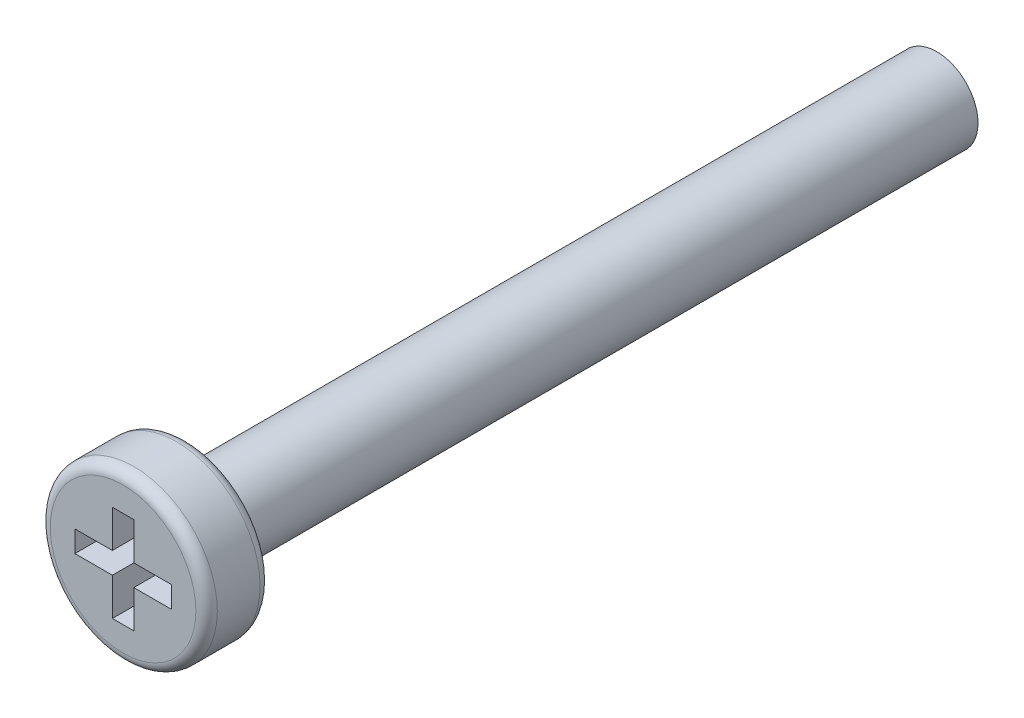
ISO-10303-21;
HEADER;
FILE_DESCRIPTION(('STEP AP214'),'2;1');
FILE_NAME('part.step','',(''),(''),'','','');
FILE_SCHEMA(('AUTOMOTIVE_DESIGN { 1 0 10303 214 1 1 1 1 }'));
ENDSEC;
DATA;
#1=APPLICATION_CONTEXT('core data for automotive mechanical design processes');
#2=APPLICATION_PROTOCOL_DEFINITION('international standard','automotive_design',2000,#1);
#3=PRODUCT_CONTEXT('',#1,'mechanical');
#4=PRODUCT('Part','Part','',(#3));
#5=PRODUCT_RELATED_PRODUCT_CATEGORY('part','',(#4));
#6=PRODUCT_DEFINITION_FORMATION('','',#4);
#7=PRODUCT_DEFINITION_CONTEXT('part definition',#1,'design');
#8=PRODUCT_DEFINITION('design','',#6,#7);
#9=PRODUCT_DEFINITION_SHAPE('','',#8);
#10=(LENGTH_UNIT() NAMED_UNIT(*) SI_UNIT(.MILLI.,.METRE.));
#11=(NAMED_UNIT(*) PLANE_ANGLE_UNIT() SI_UNIT($,.RADIAN.));
#12=(NAMED_UNIT(*) SI_UNIT($,.STERADIAN.) SOLID_ANGLE_UNIT());
#13=UNCERTAINTY_MEASURE_WITH_UNIT(LENGTH_MEASURE(1.E-05),#10,'distance_accuracy_value','');
#14=(GEOMETRIC_REPRESENTATION_CONTEXT(3) GLOBAL_UNCERTAINTY_ASSIGNED_CONTEXT((#13)) GLOBAL_UNIT_ASSIGNED_CONTEXT((#10,
#11,#12)) REPRESENTATION_CONTEXT('',''));
#15=CARTESIAN_POINT('',(0.,0.,0.));
#16=DIRECTION('',(0.,0.,1.));
#17=DIRECTION('',(1.,0.,0.));
#18=AXIS2_PLACEMENT_3D('',#15,#16,#17);
#19=CARTESIAN_POINT('',(0.,0.,0.));
#20=DIRECTION('',(0.,0.,1.));
#21=DIRECTION('',(1.,0.,0.));
#22=AXIS2_PLACEMENT_3D('',#19,#20,#21);
#23=PLANE('',#22);
#24=CARTESIAN_POINT('',(0.,0.,0.));
#25=DIRECTION('',(0.,0.,1.));
#26=DIRECTION('',(1.,0.,0.));
#27=AXIS2_PLACEMENT_3D('',#24,#25,#26);
#28=CIRCLE('',#27,3.4);
#29=CARTESIAN_POINT('',(3.4,0.,0.));
#30=VERTEX_POINT('',#29);
#31=EDGE_CURVE('E217',#30,#30,#28,.F.);
#32=ORIENTED_EDGE('',*,*,#31,.T.);
#33=EDGE_LOOP('',(#32));
#34=FACE_BOUND('',#33,.T.);
#35=CARTESIAN_POINT('',(0.,0.,0.));
#36=DIRECTION('',(0.,0.,1.));
#37=DIRECTION('',(1.,0.,0.));
#38=AXIS2_PLACEMENT_3D('',#35,#36,#37);
#39=CIRCLE('',#38,1.925);
#40=CARTESIAN_POINT('',(1.925,0.,0.));
#41=VERTEX_POINT('',#40);
#42=EDGE_CURVE('E11',#41,#41,#39,.F.);
#43=ORIENTED_EDGE('',*,*,#42,.F.);
#44=EDGE_LOOP('',(#43));
#45=FACE_BOUND('',#44,.T.);
#46=ADVANCED_FACE('F37',(#34,#45),#23,.F.);
#47=CARTESIAN_POINT('',(0.,0.,3.));
#48=DIRECTION('',(0.,0.,-1.));
#49=DIRECTION('',(-1.,0.,0.));
#50=AXIS2_PLACEMENT_3D('',#47,#48,#49);
#51=CYLINDRICAL_SURFACE('',#50,3.9);
#52=CARTESIAN_POINT('',(0.,0.,0.5));
#53=DIRECTION('',(0.,0.,1.));
#54=DIRECTION('',(1.,0.,0.));
#55=AXIS2_PLACEMENT_3D('',#52,#53,#54);
#56=CIRCLE('',#55,3.9);
#57=CARTESIAN_POINT('',(3.9,0.,0.5));
#58=VERTEX_POINT('',#57);
#59=EDGE_CURVE('E214',#58,#58,#56,.T.);
#60=ORIENTED_EDGE('',*,*,#59,.T.);
#61=EDGE_LOOP('',(#60));
#62=FACE_BOUND('',#61,.T.);
#63=CARTESIAN_POINT('',(0.,0.,2.5));
#64=DIRECTION('',(0.,0.,1.));
#65=DIRECTION('',(1.,0.,0.));
#66=AXIS2_PLACEMENT_3D('',#63,#64,#65);
#67=CIRCLE('',#66,3.9);
#68=CARTESIAN_POINT('',(3.9,0.,2.5));
#69=VERTEX_POINT('',#68);
#70=EDGE_CURVE('E194',#69,#69,#67,.F.);
#71=ORIENTED_EDGE('',*,*,#70,.T.);
#72=EDGE_LOOP('',(#71));
#73=FACE_BOUND('',#72,.T.);
#74=ADVANCED_FACE('F239',(#62,#73),#51,.T.);
#75=CARTESIAN_POINT('',(0.,0.,3.));
#76=DIRECTION('',(0.,0.,1.));
#77=DIRECTION('',(1.,0.,0.));
#78=AXIS2_PLACEMENT_3D('',#75,#76,#77);
#79=PLANE('',#78);
#80=CARTESIAN_POINT('',(0.,0.,3.));
#81=DIRECTION('',(0.,0.,1.));
#82=DIRECTION('',(1.,0.,0.));
#83=AXIS2_PLACEMENT_3D('',#80,#81,#82);
#84=CIRCLE('',#83,3.4);
#85=CARTESIAN_POINT('',(3.4,0.,3.));
#86=VERTEX_POINT('',#85);
#87=EDGE_CURVE('E45',#86,#86,#84,.T.);
#88=ORIENTED_EDGE('',*,*,#87,.T.);
#89=EDGE_LOOP('',(#88));
#90=FACE_BOUND('',#89,.T.);
#91=DIRECTION('',(0.,-1.,0.));
#92=VECTOR('',#91,1.);
#93=CARTESIAN_POINT('',(-0.5,-0.5,3.));
#94=LINE('',#93,#92);
#95=CARTESIAN_POINT('',(-0.5,-0.5,3.));
#96=VERTEX_POINT('',#95);
#97=CARTESIAN_POINT('',(-0.5,-2.25,3.));
#98=VERTEX_POINT('',#97);
#99=EDGE_CURVE('E52',#96,#98,#94,.T.);
#100=ORIENTED_EDGE('',*,*,#99,.F.);
#101=DIRECTION('',(1.,0.,0.));
#102=VECTOR('',#101,1.);
#103=CARTESIAN_POINT('',(-0.5,-0.5,3.));
#104=LINE('',#103,#102);
#105=CARTESIAN_POINT('',(-2.25,-0.5,3.));
#106=VERTEX_POINT('',#105);
#107=EDGE_CURVE('E190',#106,#96,#104,.T.);
#108=ORIENTED_EDGE('',*,*,#107,.F.);
#109=DIRECTION('',(0.,-1.,0.));
#110=VECTOR('',#109,1.);
#111=CARTESIAN_POINT('',(-2.25,0.5,3.));
#112=LINE('',#111,#110);
#113=CARTESIAN_POINT('',(-2.25,0.5,3.));
#114=VERTEX_POINT('',#113);
#115=EDGE_CURVE('E188',#114,#106,#112,.T.);
#116=ORIENTED_EDGE('',*,*,#115,.F.);
#117=DIRECTION('',(-1.,0.,0.));
#118=VECTOR('',#117,1.);
#119=CARTESIAN_POINT('',(-0.5,0.5,3.));
#120=LINE('',#119,#118);
#121=CARTESIAN_POINT('',(-0.5,0.5,3.));
#122=VERTEX_POINT('',#121);
#123=EDGE_CURVE('E136',#122,#114,#120,.T.);
#124=ORIENTED_EDGE('',*,*,#123,.F.);
#125=DIRECTION('',(0.,-1.,0.));
#126=VECTOR('',#125,1.);
#127=CARTESIAN_POINT('',(-0.5,2.25,3.));
#128=LINE('',#127,#126);
#129=CARTESIAN_POINT('',(-0.5,2.25,3.));
#130=VERTEX_POINT('',#129);
#131=EDGE_CURVE('E184',#130,#122,#128,.T.);
#132=ORIENTED_EDGE('',*,*,#131,.F.);
#133=DIRECTION('',(-1.,0.,0.));
#134=VECTOR('',#133,1.);
#135=CARTESIAN_POINT('',(0.5,2.25,3.));
#136=LINE('',#135,#134);
#137=CARTESIAN_POINT('',(0.5,2.25,3.));
#138=VERTEX_POINT('',#137);
#139=EDGE_CURVE('E181',#138,#130,#136,.T.);
#140=ORIENTED_EDGE('',*,*,#139,.F.);
#141=DIRECTION('',(0.,1.,0.));
#142=VECTOR('',#141,1.);
#143=CARTESIAN_POINT('',(0.5,2.25,3.));
#144=LINE('',#143,#142);
#145=CARTESIAN_POINT('',(0.5,0.5,3.));
#146=VERTEX_POINT('',#145);
#147=EDGE_CURVE('E178',#146,#138,#144,.T.);
#148=ORIENTED_EDGE('',*,*,#147,.F.);
#149=DIRECTION('',(-1.,0.,0.));
#150=VECTOR('',#149,1.);
#151=CARTESIAN_POINT('',(2.25,0.5,3.));
#152=LINE('',#151,#150);
#153=CARTESIAN_POINT('',(2.25,0.5,3.));
#154=VERTEX_POINT('',#153);
#155=EDGE_CURVE('E175',#154,#146,#152,.T.);
#156=ORIENTED_EDGE('',*,*,#155,.F.);
#157=DIRECTION('',(0.,1.,0.));
#158=VECTOR('',#157,1.);
#159=CARTESIAN_POINT('',(2.25,0.5,3.));
#160=LINE('',#159,#158);
#161=CARTESIAN_POINT('',(2.25,-0.5,3.));
#162=VERTEX_POINT('',#161);
#163=EDGE_CURVE('E172',#162,#154,#160,.T.);
#164=ORIENTED_EDGE('',*,*,#163,.F.);
#165=DIRECTION('',(1.,0.,0.));
#166=VECTOR('',#165,1.);
#167=CARTESIAN_POINT('',(2.25,-0.5,3.));
#168=LINE('',#167,#166);
#169=CARTESIAN_POINT('',(0.5,-0.5,3.));
#170=VERTEX_POINT('',#169);
#171=EDGE_CURVE('E169',#170,#162,#168,.T.);
#172=ORIENTED_EDGE('',*,*,#171,.F.);
#173=DIRECTION('',(0.,1.,0.));
#174=VECTOR('',#173,1.);
#175=CARTESIAN_POINT('',(0.5,-0.5,3.));
#176=LINE('',#175,#174);
#177=CARTESIAN_POINT('',(0.500000000000001,-2.25,3.));
#178=VERTEX_POINT('',#177);
#179=EDGE_CURVE('E166',#178,#170,#176,.T.);
#180=ORIENTED_EDGE('',*,*,#179,.F.);
#181=DIRECTION('',(1.,0.,0.));
#182=VECTOR('',#181,1.);
#183=CARTESIAN_POINT('',(0.500000000000001,-2.25,3.));
#184=LINE('',#183,#182);
#185=EDGE_CURVE('E162',#98,#178,#184,.T.);
#186=ORIENTED_EDGE('',*,*,#185,.F.);
#187=EDGE_LOOP('',(#100,#108,#116,#124,#132,#140,#148,#156,#164,#172,#180,#186));
#188=FACE_BOUND('',#187,.T.);
#189=ADVANCED_FACE('F222',(#90,#188),#79,.T.);
#190=CARTESIAN_POINT('',(-0.5,-0.5,1.));
#191=DIRECTION('',(-1.,0.,0.));
#192=DIRECTION('',(0.,-1.,0.));
#193=AXIS2_PLACEMENT_3D('',#190,#191,#192);
#194=PLANE('',#193);
#195=ORIENTED_EDGE('',*,*,#99,.T.);
#196=DIRECTION('',(0.,0.,1.));
#197=VECTOR('',#196,1.);
#198=CARTESIAN_POINT('',(-0.5,-2.25,1.));
#199=LINE('',#198,#197);
#200=CARTESIAN_POINT('',(-0.5,-2.25,1.));
#201=VERTEX_POINT('',#200);
#202=EDGE_CURVE('E100',#201,#98,#199,.T.);
#203=ORIENTED_EDGE('',*,*,#202,.F.);
#204=DIRECTION('',(0.,-1.,0.));
#205=VECTOR('',#204,1.);
#206=CARTESIAN_POINT('',(-0.5,-0.5,1.));
#207=LINE('',#206,#205);
#208=CARTESIAN_POINT('',(-0.5,-0.5,1.));
#209=VERTEX_POINT('',#208);
#210=EDGE_CURVE('E192',#209,#201,#207,.T.);
#211=ORIENTED_EDGE('',*,*,#210,.F.);
#212=DIRECTION('',(0.,0.,1.));
#213=VECTOR('',#212,1.);
#214=CARTESIAN_POINT('',(-0.5,-0.5,1.));
#215=LINE('',#214,#213);
#216=EDGE_CURVE('E60',#209,#96,#215,.T.);
#217=ORIENTED_EDGE('',*,*,#216,.T.);
#218=EDGE_LOOP('',(#195,#203,#211,#217));
#219=FACE_BOUND('',#218,.T.);
#220=ADVANCED_FACE('F251',(#219),#194,.F.);
#221=CARTESIAN_POINT('',(-0.5,-0.5,1.));
#222=DIRECTION('',(0.,-1.,0.));
#223=DIRECTION('',(1.,0.,0.));
#224=AXIS2_PLACEMENT_3D('',#221,#222,#223);
#225=PLANE('',#224);
#226=ORIENTED_EDGE('',*,*,#107,.T.);
#227=ORIENTED_EDGE('',*,*,#216,.F.);
#228=DIRECTION('',(1.,0.,0.));
#229=VECTOR('',#228,1.);
#230=CARTESIAN_POINT('',(-0.5,-0.5,1.));
#231=LINE('',#230,#229);
#232=CARTESIAN_POINT('',(-2.25,-0.5,1.));
#233=VERTEX_POINT('',#232);
#234=EDGE_CURVE('E148',#233,#209,#231,.T.);
#235=ORIENTED_EDGE('',*,*,#234,.F.);
#236=DIRECTION('',(0.,0.,1.));
#237=VECTOR('',#236,1.);
#238=CARTESIAN_POINT('',(-2.25,-0.5,1.));
#239=LINE('',#238,#237);
#240=EDGE_CURVE('E140',#233,#106,#239,.T.);
#241=ORIENTED_EDGE('',*,*,#240,.T.);
#242=EDGE_LOOP('',(#226,#227,#235,#241));
#243=FACE_BOUND('',#242,.T.);
#244=ADVANCED_FACE('F254',(#243),#225,.F.);
#245=CARTESIAN_POINT('',(-2.25,0.5,1.));
#246=DIRECTION('',(-1.,0.,0.));
#247=DIRECTION('',(0.,-1.,0.));
#248=AXIS2_PLACEMENT_3D('',#245,#246,#247);
#249=PLANE('',#248);
#250=ORIENTED_EDGE('',*,*,#115,.T.);
#251=ORIENTED_EDGE('',*,*,#240,.F.);
#252=DIRECTION('',(0.,-1.,0.));
#253=VECTOR('',#252,1.);
#254=CARTESIAN_POINT('',(-2.25,0.5,1.));
#255=LINE('',#254,#253);
#256=CARTESIAN_POINT('',(-2.25,0.5,1.));
#257=VERTEX_POINT('',#256);
#258=EDGE_CURVE('E144',#257,#233,#255,.T.);
#259=ORIENTED_EDGE('',*,*,#258,.F.);
#260=DIRECTION('',(0.,0.,1.));
#261=VECTOR('',#260,1.);
#262=CARTESIAN_POINT('',(-2.25,0.5,1.));
#263=LINE('',#262,#261);
#264=EDGE_CURVE('E129',#257,#114,#263,.T.);
#265=ORIENTED_EDGE('',*,*,#264,.T.);
#266=EDGE_LOOP('',(#250,#251,#259,#265));
#267=FACE_BOUND('',#266,.T.);
#268=ADVANCED_FACE('F145',(#267),#249,.F.);
#269=CARTESIAN_POINT('',(-0.5,0.5,1.));
#270=DIRECTION('',(0.,1.,0.));
#271=DIRECTION('',(-1.,0.,0.));
#272=AXIS2_PLACEMENT_3D('',#269,#270,#271);
#273=PLANE('',#272);
#274=ORIENTED_EDGE('',*,*,#123,.T.);
#275=ORIENTED_EDGE('',*,*,#264,.F.);
#276=DIRECTION('',(-1.,0.,0.));
#277=VECTOR('',#276,1.);
#278=CARTESIAN_POINT('',(-0.5,0.5,1.));
#279=LINE('',#278,#277);
#280=CARTESIAN_POINT('',(-0.5,0.5,1.));
#281=VERTEX_POINT('',#280);
#282=EDGE_CURVE('E133',#281,#257,#279,.T.);
#283=ORIENTED_EDGE('',*,*,#282,.F.);
#284=DIRECTION('',(0.,0.,1.));
#285=VECTOR('',#284,1.);
#286=CARTESIAN_POINT('',(-0.5,0.5,1.));
#287=LINE('',#286,#285);
#288=EDGE_CURVE('E141',#281,#122,#287,.T.);
#289=ORIENTED_EDGE('',*,*,#288,.T.);
#290=EDGE_LOOP('',(#274,#275,#283,#289));
#291=FACE_BOUND('',#290,.T.);
#292=ADVANCED_FACE('F131',(#291),#273,.F.);
#293=CARTESIAN_POINT('',(-0.5,2.25,1.));
#294=DIRECTION('',(-1.,0.,0.));
#295=DIRECTION('',(0.,-1.,0.));
#296=AXIS2_PLACEMENT_3D('',#293,#294,#295);
#297=PLANE('',#296);
#298=ORIENTED_EDGE('',*,*,#131,.T.);
#299=ORIENTED_EDGE('',*,*,#288,.F.);
#300=DIRECTION('',(0.,-1.,0.));
#301=VECTOR('',#300,1.);
#302=CARTESIAN_POINT('',(-0.5,2.25,1.));
#303=LINE('',#302,#301);
#304=CARTESIAN_POINT('',(-0.5,2.25,1.));
#305=VERTEX_POINT('',#304);
#306=EDGE_CURVE('E154',#305,#281,#303,.T.);
#307=ORIENTED_EDGE('',*,*,#306,.F.);
#308=DIRECTION('',(0.,0.,1.));
#309=VECTOR('',#308,1.);
#310=CARTESIAN_POINT('',(-0.5,2.25,1.));
#311=LINE('',#310,#309);
#312=EDGE_CURVE('E197',#305,#130,#311,.T.);
#313=ORIENTED_EDGE('',*,*,#312,.T.);
#314=EDGE_LOOP('',(#298,#299,#307,#313));
#315=FACE_BOUND('',#314,.T.);
#316=ADVANCED_FACE('F282',(#315),#297,.F.);
#317=CARTESIAN_POINT('',(0.5,2.25,1.));
#318=DIRECTION('',(0.,1.,0.));
#319=DIRECTION('',(-1.,0.,0.));
#320=AXIS2_PLACEMENT_3D('',#317,#318,#319);
#321=PLANE('',#320);
#322=ORIENTED_EDGE('',*,*,#139,.T.);
#323=ORIENTED_EDGE('',*,*,#312,.F.);
#324=DIRECTION('',(-1.,0.,0.));
#325=VECTOR('',#324,1.);
#326=CARTESIAN_POINT('',(0.5,2.25,1.));
#327=LINE('',#326,#325);
#328=CARTESIAN_POINT('',(0.5,2.25,1.));
#329=VERTEX_POINT('',#328);
#330=EDGE_CURVE('E156',#329,#305,#327,.T.);
#331=ORIENTED_EDGE('',*,*,#330,.F.);
#332=DIRECTION('',(0.,0.,1.));
#333=VECTOR('',#332,1.);
#334=CARTESIAN_POINT('',(0.5,2.25,1.));
#335=LINE('',#334,#333);
#336=EDGE_CURVE('E199',#329,#138,#335,.T.);
#337=ORIENTED_EDGE('',*,*,#336,.T.);
#338=EDGE_LOOP('',(#322,#323,#331,#337));
#339=FACE_BOUND('',#338,.T.);
#340=ADVANCED_FACE('F278',(#339),#321,.F.);
#341=CARTESIAN_POINT('',(0.5,2.25,1.));
#342=DIRECTION('',(1.,0.,0.));
#343=DIRECTION('',(0.,1.,0.));
#344=AXIS2_PLACEMENT_3D('',#341,#342,#343);
#345=PLANE('',#344);
#346=ORIENTED_EDGE('',*,*,#147,.T.);
#347=ORIENTED_EDGE('',*,*,#336,.F.);
#348=DIRECTION('',(0.,1.,0.));
#349=VECTOR('',#348,1.);
#350=CARTESIAN_POINT('',(0.5,2.25,1.));
#351=LINE('',#350,#349);
#352=CARTESIAN_POINT('',(0.5,0.5,1.));
#353=VERTEX_POINT('',#352);
#354=EDGE_CURVE('E319',#353,#329,#351,.T.);
#355=ORIENTED_EDGE('',*,*,#354,.F.);
#356=DIRECTION('',(0.,0.,1.));
#357=VECTOR('',#356,1.);
#358=CARTESIAN_POINT('',(0.5,0.5,1.));
#359=LINE('',#358,#357);
#360=EDGE_CURVE('E201',#353,#146,#359,.T.);
#361=ORIENTED_EDGE('',*,*,#360,.T.);
#362=EDGE_LOOP('',(#346,#347,#355,#361));
#363=FACE_BOUND('',#362,.T.);
#364=ADVANCED_FACE('F274',(#363),#345,.F.);
#365=CARTESIAN_POINT('',(2.25,0.5,1.));
#366=DIRECTION('',(0.,1.,0.));
#367=DIRECTION('',(-1.,0.,0.));
#368=AXIS2_PLACEMENT_3D('',#365,#366,#367);
#369=PLANE('',#368);
#370=ORIENTED_EDGE('',*,*,#155,.T.);
#371=ORIENTED_EDGE('',*,*,#360,.F.);
#372=DIRECTION('',(-1.,0.,0.));
#373=VECTOR('',#372,1.);
#374=CARTESIAN_POINT('',(2.25,0.5,1.));
#375=LINE('',#374,#373);
#376=CARTESIAN_POINT('',(2.25,0.5,1.));
#377=VERTEX_POINT('',#376);
#378=EDGE_CURVE('E316',#377,#353,#375,.T.);
#379=ORIENTED_EDGE('',*,*,#378,.F.);
#380=DIRECTION('',(0.,0.,1.));
#381=VECTOR('',#380,1.);
#382=CARTESIAN_POINT('',(2.25,0.5,1.));
#383=LINE('',#382,#381);
#384=EDGE_CURVE('E203',#377,#154,#383,.T.);
#385=ORIENTED_EDGE('',*,*,#384,.T.);
#386=EDGE_LOOP('',(#370,#371,#379,#385));
#387=FACE_BOUND('',#386,.T.);
#388=ADVANCED_FACE('F270',(#387),#369,.F.);
#389=CARTESIAN_POINT('',(2.25,0.5,1.));
#390=DIRECTION('',(1.,0.,0.));
#391=DIRECTION('',(0.,0.,-1.));
#392=AXIS2_PLACEMENT_3D('',#389,#390,#391);
#393=PLANE('',#392);
#394=ORIENTED_EDGE('',*,*,#163,.T.);
#395=ORIENTED_EDGE('',*,*,#384,.F.);
#396=DIRECTION('',(0.,1.,0.));
#397=VECTOR('',#396,1.);
#398=CARTESIAN_POINT('',(2.25,0.5,1.));
#399=LINE('',#398,#397);
#400=CARTESIAN_POINT('',(2.25,-0.5,1.));
#401=VERTEX_POINT('',#400);
#402=EDGE_CURVE('E313',#401,#377,#399,.T.);
#403=ORIENTED_EDGE('',*,*,#402,.F.);
#404=DIRECTION('',(0.,0.,1.));
#405=VECTOR('',#404,1.);
#406=CARTESIAN_POINT('',(2.25,-0.5,1.));
#407=LINE('',#406,#405);
#408=EDGE_CURVE('E205',#401,#162,#407,.T.);
#409=ORIENTED_EDGE('',*,*,#408,.T.);
#410=EDGE_LOOP('',(#394,#395,#403,#409));
#411=FACE_BOUND('',#410,.T.);
#412=ADVANCED_FACE('F266',(#411),#393,.F.);
#413=CARTESIAN_POINT('',(2.25,-0.5,1.));
#414=DIRECTION('',(0.,-1.,0.));
#415=DIRECTION('',(1.,0.,0.));
#416=AXIS2_PLACEMENT_3D('',#413,#414,#415);
#417=PLANE('',#416);
#418=ORIENTED_EDGE('',*,*,#171,.T.);
#419=ORIENTED_EDGE('',*,*,#408,.F.);
#420=DIRECTION('',(1.,0.,0.));
#421=VECTOR('',#420,1.);
#422=CARTESIAN_POINT('',(2.25,-0.5,1.));
#423=LINE('',#422,#421);
#424=CARTESIAN_POINT('',(0.5,-0.5,1.));
#425=VERTEX_POINT('',#424);
#426=EDGE_CURVE('E310',#425,#401,#423,.T.);
#427=ORIENTED_EDGE('',*,*,#426,.F.);
#428=DIRECTION('',(0.,0.,1.));
#429=VECTOR('',#428,1.);
#430=CARTESIAN_POINT('',(0.5,-0.5,1.));
#431=LINE('',#430,#429);
#432=EDGE_CURVE('E207',#425,#170,#431,.T.);
#433=ORIENTED_EDGE('',*,*,#432,.T.);
#434=EDGE_LOOP('',(#418,#419,#427,#433));
#435=FACE_BOUND('',#434,.T.);
#436=ADVANCED_FACE('F262',(#435),#417,.F.);
#437=CARTESIAN_POINT('',(0.5,-0.5,1.));
#438=DIRECTION('',(1.,0.,0.));
#439=DIRECTION('',(0.,1.,0.));
#440=AXIS2_PLACEMENT_3D('',#437,#438,#439);
#441=PLANE('',#440);
#442=ORIENTED_EDGE('',*,*,#179,.T.);
#443=ORIENTED_EDGE('',*,*,#432,.F.);
#444=DIRECTION('',(0.,1.,0.));
#445=VECTOR('',#444,1.);
#446=CARTESIAN_POINT('',(0.5,-0.5,1.));
#447=LINE('',#446,#445);
#448=CARTESIAN_POINT('',(0.500000000000001,-2.25,1.));
#449=VERTEX_POINT('',#448);
#450=EDGE_CURVE('E307',#449,#425,#447,.T.);
#451=ORIENTED_EDGE('',*,*,#450,.F.);
#452=DIRECTION('',(0.,0.,1.));
#453=VECTOR('',#452,1.);
#454=CARTESIAN_POINT('',(0.500000000000001,-2.25,1.));
#455=LINE('',#454,#453);
#456=EDGE_CURVE('E209',#449,#178,#455,.T.);
#457=ORIENTED_EDGE('',*,*,#456,.T.);
#458=EDGE_LOOP('',(#442,#443,#451,#457));
#459=FACE_BOUND('',#458,.T.);
#460=ADVANCED_FACE('F258',(#459),#441,.F.);
#461=CARTESIAN_POINT('',(0.500000000000001,-2.25,1.));
#462=DIRECTION('',(0.,-1.,0.));
#463=DIRECTION('',(1.,0.,0.));
#464=AXIS2_PLACEMENT_3D('',#461,#462,#463);
#465=PLANE('',#464);
#466=ORIENTED_EDGE('',*,*,#185,.T.);
#467=ORIENTED_EDGE('',*,*,#456,.F.);
#468=DIRECTION('',(1.,0.,0.));
#469=VECTOR('',#468,1.);
#470=CARTESIAN_POINT('',(0.500000000000001,-2.25,1.));
#471=LINE('',#470,#469);
#472=EDGE_CURVE('E304',#201,#449,#471,.T.);
#473=ORIENTED_EDGE('',*,*,#472,.F.);
#474=ORIENTED_EDGE('',*,*,#202,.T.);
#475=EDGE_LOOP('',(#466,#467,#473,#474));
#476=FACE_BOUND('',#475,.T.);
#477=ADVANCED_FACE('F255',(#476),#465,.F.);
#478=CARTESIAN_POINT('',(0.,0.,1.));
#479=DIRECTION('',(0.,0.,-1.));
#480=DIRECTION('',(-1.,0.,0.));
#481=AXIS2_PLACEMENT_3D('',#478,#479,#480);
#482=PLANE('',#481);
#483=ORIENTED_EDGE('',*,*,#210,.T.);
#484=ORIENTED_EDGE('',*,*,#472,.T.);
#485=ORIENTED_EDGE('',*,*,#450,.T.);
#486=ORIENTED_EDGE('',*,*,#426,.T.);
#487=ORIENTED_EDGE('',*,*,#402,.T.);
#488=ORIENTED_EDGE('',*,*,#378,.T.);
#489=ORIENTED_EDGE('',*,*,#354,.T.);
#490=ORIENTED_EDGE('',*,*,#330,.T.);
#491=ORIENTED_EDGE('',*,*,#306,.T.);
#492=ORIENTED_EDGE('',*,*,#282,.T.);
#493=ORIENTED_EDGE('',*,*,#258,.T.);
#494=ORIENTED_EDGE('',*,*,#234,.T.);
#495=EDGE_LOOP('',(#483,#484,#485,#486,#487,#488,#489,#490,#491,#492,#493,#494));
#496=FACE_BOUND('',#495,.T.);
#497=ADVANCED_FACE('F151',(#496),#482,.F.);
#498=CARTESIAN_POINT('',(0.,0.,0.5));
#499=DIRECTION('',(0.,0.,1.));
#500=DIRECTION('',(1.,0.,0.));
#501=AXIS2_PLACEMENT_3D('',#498,#499,#500);
#502=TOROIDAL_SURFACE('',#501,3.4,0.5);
#503=ORIENTED_EDGE('',*,*,#31,.F.);
#504=EDGE_LOOP('',(#503));
#505=FACE_BOUND('',#504,.T.);
#506=ORIENTED_EDGE('',*,*,#59,.F.);
#507=EDGE_LOOP('',(#506));
#508=FACE_BOUND('',#507,.T.);
#509=ADVANCED_FACE('F227',(#505,#508),#502,.T.);
#510=CARTESIAN_POINT('',(0.,0.,2.5));
#511=DIRECTION('',(0.,0.,1.));
#512=DIRECTION('',(1.,0.,0.));
#513=AXIS2_PLACEMENT_3D('',#510,#511,#512);
#514=TOROIDAL_SURFACE('',#513,3.4,0.5);
#515=ORIENTED_EDGE('',*,*,#70,.F.);
#516=EDGE_LOOP('',(#515));
#517=FACE_BOUND('',#516,.T.);
#518=ORIENTED_EDGE('',*,*,#87,.F.);
#519=EDGE_LOOP('',(#518));
#520=FACE_BOUND('',#519,.T.);
#521=ADVANCED_FACE('F39',(#517,#520),#514,.T.);
#522=CARTESIAN_POINT('',(0.,0.,-35.));
#523=DIRECTION('',(0.,0.,1.));
#524=DIRECTION('',(1.,0.,0.));
#525=AXIS2_PLACEMENT_3D('',#522,#523,#524);
#526=CYLINDRICAL_SURFACE('',#525,1.925);
#527=CARTESIAN_POINT('',(0.,0.,-35.));
#528=DIRECTION('',(0.,0.,-1.));
#529=DIRECTION('',(-1.,0.,0.));
#530=AXIS2_PLACEMENT_3D('',#527,#528,#529);
#531=CIRCLE('',#530,1.925);
#532=CARTESIAN_POINT('',(-1.925,0.,-35.));
#533=VERTEX_POINT('',#532);
#534=EDGE_CURVE('E163',#533,#533,#531,.T.);
#535=ORIENTED_EDGE('',*,*,#534,.F.);
#536=EDGE_LOOP('',(#535));
#537=FACE_BOUND('',#536,.T.);
#538=ORIENTED_EDGE('',*,*,#42,.T.);
#539=EDGE_LOOP('',(#538));
#540=FACE_BOUND('',#539,.T.);
#541=ADVANCED_FACE('F226',(#537,#540),#526,.T.);
#542=CARTESIAN_POINT('',(0.,0.,-35.));
#543=DIRECTION('',(0.,0.,-1.));
#544=DIRECTION('',(-1.,0.,0.));
#545=AXIS2_PLACEMENT_3D('',#542,#543,#544);
#546=PLANE('',#545);
#547=ORIENTED_EDGE('',*,*,#534,.T.);
#548=EDGE_LOOP('',(#547));
#549=FACE_BOUND('',#548,.T.);
#550=ADVANCED_FACE('F233',(#549),#546,.T.);
#551=CLOSED_SHELL('',(#46,#74,#189,#220,#244,#268,#292,#316,#340,#364,#388,#412,#436,#460,#477,
#497,#509,#521,#541,#550));
#552=MANIFOLD_SOLID_BREP('B2',#551);
#553=ADVANCED_BREP_SHAPE_REPRESENTATION('',(#18,#552),#14);
#554=SHAPE_DEFINITION_REPRESENTATION(#9,#553);
ENDSEC;
END-ISO-10303-21;
